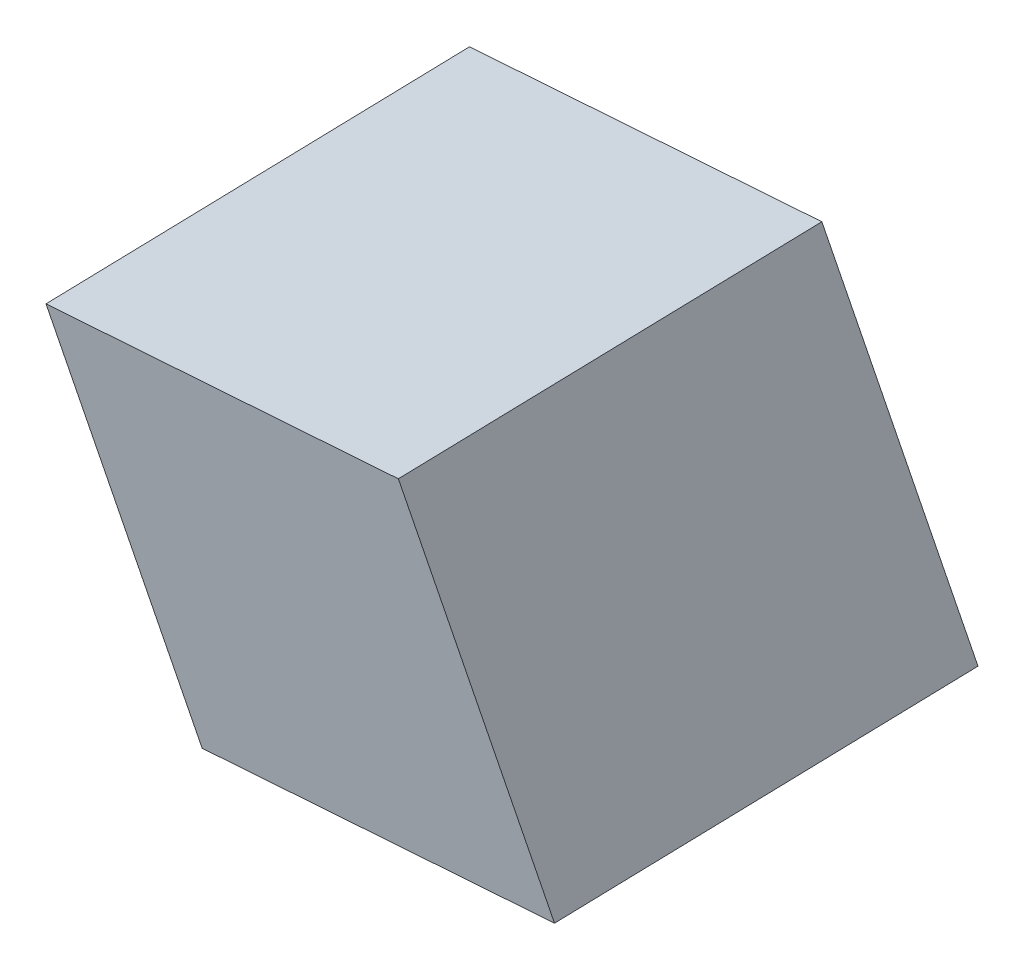
ISO-10303-21;
HEADER;
FILE_DESCRIPTION(('STEP AP214'),'2;1');
FILE_NAME('part.step','',(''),(''),'','','');
FILE_SCHEMA(('AUTOMOTIVE_DESIGN { 1 0 10303 214 1 1 1 1 }'));
ENDSEC;
DATA;
#1=APPLICATION_CONTEXT('core data for automotive mechanical design processes');
#2=APPLICATION_PROTOCOL_DEFINITION('international standard','automotive_design',2000,#1);
#3=PRODUCT_CONTEXT('',#1,'mechanical');
#4=PRODUCT('Part','Part','',(#3));
#5=PRODUCT_RELATED_PRODUCT_CATEGORY('part','',(#4));
#6=PRODUCT_DEFINITION_FORMATION('','',#4);
#7=PRODUCT_DEFINITION_CONTEXT('part definition',#1,'design');
#8=PRODUCT_DEFINITION('design','',#6,#7);
#9=PRODUCT_DEFINITION_SHAPE('','',#8);
#10=(LENGTH_UNIT() NAMED_UNIT(*) SI_UNIT(.MILLI.,.METRE.));
#11=(NAMED_UNIT(*) PLANE_ANGLE_UNIT() SI_UNIT($,.RADIAN.));
#12=(NAMED_UNIT(*) SI_UNIT($,.STERADIAN.) SOLID_ANGLE_UNIT());
#13=UNCERTAINTY_MEASURE_WITH_UNIT(LENGTH_MEASURE(1.E-05),#10,'distance_accuracy_value','');
#14=(GEOMETRIC_REPRESENTATION_CONTEXT(3) GLOBAL_UNCERTAINTY_ASSIGNED_CONTEXT((#13)) GLOBAL_UNIT_ASSIGNED_CONTEXT((#10,
#11,#12)) REPRESENTATION_CONTEXT('',''));
#15=CARTESIAN_POINT('',(0.,0.,0.));
#16=DIRECTION('',(0.,0.,1.));
#17=DIRECTION('',(1.,0.,0.));
#18=AXIS2_PLACEMENT_3D('',#15,#16,#17);
#19=CARTESIAN_POINT('',(-643.289324417343,608.270134894167,-120.165494449766));
#20=DIRECTION('',(-0.154651292781331,-0.183537823036409,0.970771263046099));
#21=DIRECTION('',(0.,-0.982592720357793,-0.185772834127794));
#22=AXIS2_PLACEMENT_3D('',#19,#20,#21);
#23=PLANE('',#22);
#24=DIRECTION('',(0.279888476896237,-0.950477264495736,-0.13511258334222));
#25=VECTOR('',#24,1.);
#26=CARTESIAN_POINT('',(-169.542182436051,733.676312166022,-20.9841647217464));
#27=LINE('',#26,#25);
#28=CARTESIAN_POINT('',(-169.542182436051,733.676312166022,-20.9841647217464));
#29=VERTEX_POINT('',#28);
#30=CARTESIAN_POINT('',(-57.5867916775563,353.485406367728,-75.0291980586343));
#31=VERTEX_POINT('',#30);
#32=EDGE_CURVE('E102',#29,#31,#27,.T.);
#33=ORIENTED_EDGE('',*,*,#32,.F.);
#34=DIRECTION('',(0.947494283962583,0.250812354543709,0.19836265945604));
#35=VECTOR('',#34,1.);
#36=CARTESIAN_POINT('',(-643.289324417343,608.270134894167,-120.165494449766));
#37=LINE('',#36,#35);
#38=CARTESIAN_POINT('',(-643.289324417343,608.270134894167,-120.165494449766));
#39=VERTEX_POINT('',#38);
#40=EDGE_CURVE('E11',#39,#29,#37,.T.);
#41=ORIENTED_EDGE('',*,*,#40,.F.);
#42=DIRECTION('',(0.279888476896237,-0.950477264495736,-0.13511258334222));
#43=VECTOR('',#42,1.);
#44=CARTESIAN_POINT('',(-643.289324417343,608.270134894167,-120.165494449766));
#45=LINE('',#44,#43);
#46=CARTESIAN_POINT('',(-531.333933658848,228.079229095873,-174.210527786654));
#47=VERTEX_POINT('',#46);
#48=EDGE_CURVE('E97',#39,#47,#45,.T.);
#49=ORIENTED_EDGE('',*,*,#48,.T.);
#50=DIRECTION('',(0.947494283962583,0.250812354543709,0.19836265945604));
#51=VECTOR('',#50,1.);
#52=CARTESIAN_POINT('',(-531.333933658848,228.079229095873,-174.210527786654));
#53=LINE('',#52,#51);
#54=EDGE_CURVE('E40',#47,#31,#53,.T.);
#55=ORIENTED_EDGE('',*,*,#54,.T.);
#56=EDGE_LOOP('',(#33,#41,#49,#55));
#57=FACE_BOUND('',#56,.T.);
#58=ADVANCED_FACE('F37',(#57),#23,.T.);
#59=CARTESIAN_POINT('',(-643.289324417343,608.270134894167,-120.165494449766));
#60=DIRECTION('',(0.279888476896237,-0.950477264495736,-0.13511258334222));
#61=DIRECTION('',(0.959273560561635,0.282478735495972,0.));
#62=AXIS2_PLACEMENT_3D('',#59,#60,#61);
#63=PLANE('',#62);
#64=DIRECTION('',(0.154651292781331,0.183537823036409,-0.970771263046099));
#65=VECTOR('',#64,1.);
#66=CARTESIAN_POINT('',(-169.542182436051,733.676312166022,-20.9841647217464));
#67=LINE('',#66,#65);
#68=CARTESIAN_POINT('',(-107.681665323519,807.091441380586,-409.292669940186));
#69=VERTEX_POINT('',#68);
#70=EDGE_CURVE('E70',#29,#69,#67,.T.);
#71=ORIENTED_EDGE('',*,*,#70,.T.);
#72=DIRECTION('',(0.947494283962583,0.250812354543709,0.19836265945604));
#73=VECTOR('',#72,1.);
#74=CARTESIAN_POINT('',(-581.42880730481,681.685264108731,-508.473999668206));
#75=LINE('',#74,#73);
#76=CARTESIAN_POINT('',(-581.42880730481,681.685264108731,-508.473999668206));
#77=VERTEX_POINT('',#76);
#78=EDGE_CURVE('E46',#77,#69,#75,.T.);
#79=ORIENTED_EDGE('',*,*,#78,.F.);
#80=DIRECTION('',(0.154651292781331,0.183537823036409,-0.970771263046099));
#81=VECTOR('',#80,1.);
#82=CARTESIAN_POINT('',(-643.289324417343,608.270134894167,-120.165494449766));
#83=LINE('',#82,#81);
#84=EDGE_CURVE('E87',#39,#77,#83,.T.);
#85=ORIENTED_EDGE('',*,*,#84,.F.);
#86=ORIENTED_EDGE('',*,*,#40,.T.);
#87=EDGE_LOOP('',(#71,#79,#85,#86));
#88=FACE_BOUND('',#87,.T.);
#89=ADVANCED_FACE('F112',(#88),#63,.F.);
#90=CARTESIAN_POINT('',(-581.42880730481,681.685264108731,-508.473999668206));
#91=DIRECTION('',(-0.154651292781331,-0.183537823036409,0.970771263046099));
#92=DIRECTION('',(0.,-0.982592720357793,-0.185772834127794));
#93=AXIS2_PLACEMENT_3D('',#90,#91,#92);
#94=PLANE('',#93);
#95=DIRECTION('',(0.279888476896237,-0.950477264495736,-0.13511258334222));
#96=VECTOR('',#95,1.);
#97=CARTESIAN_POINT('',(-107.681665323519,807.091441380586,-409.292669940186));
#98=LINE('',#97,#96);
#99=CARTESIAN_POINT('',(4.27372543497596,426.900535582291,-463.337703277074));
#100=VERTEX_POINT('',#99);
#101=EDGE_CURVE('E94',#69,#100,#98,.T.);
#102=ORIENTED_EDGE('',*,*,#101,.T.);
#103=DIRECTION('',(0.947494283962583,0.250812354543709,0.19836265945604));
#104=VECTOR('',#103,1.);
#105=CARTESIAN_POINT('',(-469.473416546316,301.494358310437,-562.519033005094));
#106=LINE('',#105,#104);
#107=CARTESIAN_POINT('',(-469.473416546316,301.494358310437,-562.519033005094));
#108=VERTEX_POINT('',#107);
#109=EDGE_CURVE('E91',#108,#100,#106,.T.);
#110=ORIENTED_EDGE('',*,*,#109,.F.);
#111=DIRECTION('',(0.279888476896237,-0.950477264495736,-0.13511258334222));
#112=VECTOR('',#111,1.);
#113=CARTESIAN_POINT('',(-581.42880730481,681.685264108731,-508.473999668206));
#114=LINE('',#113,#112);
#115=EDGE_CURVE('E82',#77,#108,#114,.T.);
#116=ORIENTED_EDGE('',*,*,#115,.F.);
#117=ORIENTED_EDGE('',*,*,#78,.T.);
#118=EDGE_LOOP('',(#102,#110,#116,#117));
#119=FACE_BOUND('',#118,.T.);
#120=ADVANCED_FACE('F92',(#119),#94,.F.);
#121=CARTESIAN_POINT('',(-531.333933658848,228.079229095873,-174.210527786654));
#122=DIRECTION('',(0.279888476896237,-0.950477264495736,-0.13511258334222));
#123=DIRECTION('',(0.959273560561635,0.282478735495972,0.));
#124=AXIS2_PLACEMENT_3D('',#121,#122,#123);
#125=PLANE('',#124);
#126=DIRECTION('',(0.154651292781331,0.183537823036409,-0.970771263046099));
#127=VECTOR('',#126,1.);
#128=CARTESIAN_POINT('',(-57.5867916775563,353.485406367728,-75.0291980586343));
#129=LINE('',#128,#127);
#130=EDGE_CURVE('E105',#31,#100,#129,.T.);
#131=ORIENTED_EDGE('',*,*,#130,.F.);
#132=ORIENTED_EDGE('',*,*,#54,.F.);
#133=DIRECTION('',(0.154651292781331,0.183537823036409,-0.970771263046099));
#134=VECTOR('',#133,1.);
#135=CARTESIAN_POINT('',(-531.333933658848,228.079229095873,-174.210527786654));
#136=LINE('',#135,#134);
#137=EDGE_CURVE('E86',#47,#108,#136,.T.);
#138=ORIENTED_EDGE('',*,*,#137,.T.);
#139=ORIENTED_EDGE('',*,*,#109,.T.);
#140=EDGE_LOOP('',(#131,#132,#138,#139));
#141=FACE_BOUND('',#140,.T.);
#142=ADVANCED_FACE('F96',(#141),#125,.T.);
#143=CARTESIAN_POINT('',(-455.543540834465,-120.587480059545,-95.3703149321732));
#144=DIRECTION('',(0.947494283962583,0.250812354543709,0.19836265945604));
#145=DIRECTION('',(-0.25589736967279,0.966703954783752,0.));
#146=AXIS2_PLACEMENT_3D('',#143,#144,#145);
#147=PLANE('',#146);
#148=ORIENTED_EDGE('',*,*,#48,.F.);
#149=ORIENTED_EDGE('',*,*,#84,.T.);
#150=ORIENTED_EDGE('',*,*,#115,.T.);
#151=ORIENTED_EDGE('',*,*,#137,.F.);
#152=EDGE_LOOP('',(#148,#149,#150,#151));
#153=FACE_BOUND('',#152,.T.);
#154=ADVANCED_FACE('F85',(#153),#147,.F.);
#155=CARTESIAN_POINT('',(18.2036011468269,4.81869721231008,3.81101479584673));
#156=DIRECTION('',(0.947494283962583,0.250812354543709,0.19836265945604));
#157=DIRECTION('',(-0.25589736967279,0.966703954783752,0.));
#158=AXIS2_PLACEMENT_3D('',#155,#156,#157);
#159=PLANE('',#158);
#160=ORIENTED_EDGE('',*,*,#32,.T.);
#161=ORIENTED_EDGE('',*,*,#130,.T.);
#162=ORIENTED_EDGE('',*,*,#101,.F.);
#163=ORIENTED_EDGE('',*,*,#70,.F.);
#164=EDGE_LOOP('',(#160,#161,#162,#163));
#165=FACE_BOUND('',#164,.T.);
#166=ADVANCED_FACE('F110',(#165),#159,.T.);
#167=CLOSED_SHELL('',(#58,#89,#120,#142,#154,#166));
#168=MANIFOLD_SOLID_BREP('B2',#167);
#169=ADVANCED_BREP_SHAPE_REPRESENTATION('',(#18,#168),#14);
#170=SHAPE_DEFINITION_REPRESENTATION(#9,#169);
ENDSEC;
END-ISO-10303-21;
